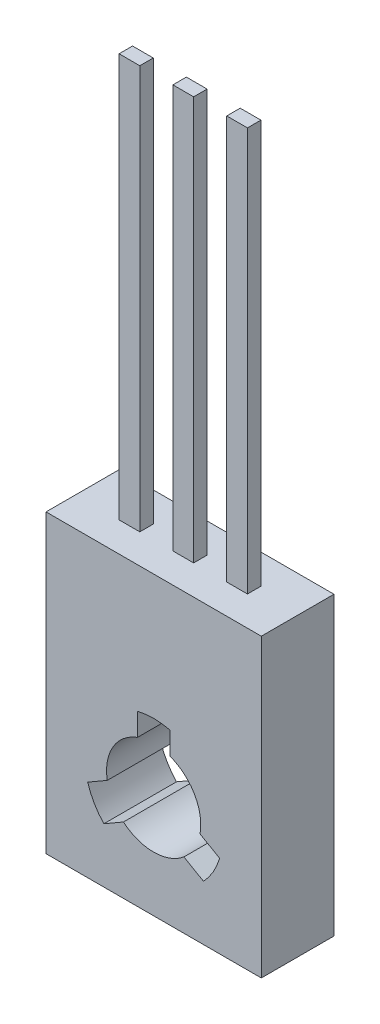
ISO-10303-21;
HEADER;
FILE_DESCRIPTION(('STEP AP214'),'2;1');
FILE_NAME('part.step','',(''),(''),'','','');
FILE_SCHEMA(('AUTOMOTIVE_DESIGN { 1 0 10303 214 1 1 1 1 }'));
ENDSEC;
DATA;
#1=APPLICATION_CONTEXT('core data for automotive mechanical design processes');
#2=APPLICATION_PROTOCOL_DEFINITION('international standard','automotive_design',2000,#1);
#3=PRODUCT_CONTEXT('',#1,'mechanical');
#4=PRODUCT('Part','Part','',(#3));
#5=PRODUCT_RELATED_PRODUCT_CATEGORY('part','',(#4));
#6=PRODUCT_DEFINITION_FORMATION('','',#4);
#7=PRODUCT_DEFINITION_CONTEXT('part definition',#1,'design');
#8=PRODUCT_DEFINITION('design','',#6,#7);
#9=PRODUCT_DEFINITION_SHAPE('','',#8);
#10=(LENGTH_UNIT() NAMED_UNIT(*) SI_UNIT(.MILLI.,.METRE.));
#11=(NAMED_UNIT(*) PLANE_ANGLE_UNIT() SI_UNIT($,.RADIAN.));
#12=(NAMED_UNIT(*) SI_UNIT($,.STERADIAN.) SOLID_ANGLE_UNIT());
#13=UNCERTAINTY_MEASURE_WITH_UNIT(LENGTH_MEASURE(1.E-05),#10,'distance_accuracy_value','');
#14=(GEOMETRIC_REPRESENTATION_CONTEXT(3) GLOBAL_UNCERTAINTY_ASSIGNED_CONTEXT((#13)) GLOBAL_UNIT_ASSIGNED_CONTEXT((#10,
#11,#12)) REPRESENTATION_CONTEXT('',''));
#15=CARTESIAN_POINT('',(0.,0.,0.));
#16=DIRECTION('',(0.,0.,1.));
#17=DIRECTION('',(1.,0.,0.));
#18=AXIS2_PLACEMENT_3D('',#15,#16,#17);
#19=CARTESIAN_POINT('',(0.,-1.7,1.35));
#20=DIRECTION('',(0.,0.,-1.));
#21=DIRECTION('',(-1.,0.,0.));
#22=AXIS2_PLACEMENT_3D('',#19,#20,#21);
#23=CYLINDRICAL_SURFACE('',#22,2.555);
#24=DIRECTION('',(0.,0.,-1.));
#25=VECTOR('',#24,1.);
#26=CARTESIAN_POINT('',(-1.85081815828303,-3.46139068493331,1.35));
#27=LINE('',#26,#25);
#28=CARTESIAN_POINT('',(-1.85081815828303,-3.46139068493331,-1.35));
#29=VERTEX_POINT('',#28);
#30=CARTESIAN_POINT('',(-1.85081815828303,-3.46139068493331,1.35));
#31=VERTEX_POINT('',#30);
#32=EDGE_CURVE('E264',#29,#31,#27,.F.);
#33=ORIENTED_EDGE('',*,*,#32,.F.);
#34=CARTESIAN_POINT('',(0.,-1.7,-1.35));
#35=DIRECTION('',(0.,0.,1.));
#36=DIRECTION('',(1.,0.,0.));
#37=AXIS2_PLACEMENT_3D('',#34,#35,#36);
#38=CIRCLE('',#37,2.555);
#39=CARTESIAN_POINT('',(-2.45081815828303,-2.42216020039198,-1.35));
#40=VERTEX_POINT('',#39);
#41=EDGE_CURVE('E461',#40,#29,#38,.T.);
#42=ORIENTED_EDGE('',*,*,#41,.F.);
#43=DIRECTION('',(0.,0.,-1.));
#44=VECTOR('',#43,1.);
#45=CARTESIAN_POINT('',(-2.45081815828303,-2.42216020039198,1.35));
#46=LINE('',#45,#44);
#47=CARTESIAN_POINT('',(-2.45081815828303,-2.42216020039198,1.35));
#48=VERTEX_POINT('',#47);
#49=EDGE_CURVE('E507',#48,#40,#46,.T.);
#50=ORIENTED_EDGE('',*,*,#49,.F.);
#51=CARTESIAN_POINT('',(0.,-1.7,1.35));
#52=DIRECTION('',(0.,0.,1.));
#53=DIRECTION('',(1.,0.,0.));
#54=AXIS2_PLACEMENT_3D('',#51,#52,#53);
#55=CIRCLE('',#54,2.555);
#56=EDGE_CURVE('E455',#48,#31,#55,.T.);
#57=ORIENTED_EDGE('',*,*,#56,.T.);
#58=EDGE_LOOP('',(#33,#42,#50,#57));
#59=FACE_BOUND('',#58,.T.);
#60=ADVANCED_FACE('F39',(#59),#23,.F.);
#61=DIRECTION('',(0.,0.,-1.));
#62=VECTOR('',#61,1.);
#63=CARTESIAN_POINT('',(1.85081815828303,-3.4613906849333,1.35));
#64=LINE('',#63,#62);
#65=CARTESIAN_POINT('',(1.85081815828303,-3.4613906849333,1.35));
#66=VERTEX_POINT('',#65);
#67=CARTESIAN_POINT('',(1.85081815828303,-3.4613906849333,-1.35));
#68=VERTEX_POINT('',#67);
#69=EDGE_CURVE('E260',#66,#68,#64,.T.);
#70=ORIENTED_EDGE('',*,*,#69,.F.);
#71=CARTESIAN_POINT('',(2.45081815828303,-2.42216020039198,1.35));
#72=VERTEX_POINT('',#71);
#73=EDGE_CURVE('E233',#66,#72,#55,.T.);
#74=ORIENTED_EDGE('',*,*,#73,.T.);
#75=DIRECTION('',(0.,0.,-1.));
#76=VECTOR('',#75,1.);
#77=CARTESIAN_POINT('',(2.45081815828303,-2.42216020039198,1.35));
#78=LINE('',#77,#76);
#79=CARTESIAN_POINT('',(2.45081815828303,-2.42216020039198,-1.35));
#80=VERTEX_POINT('',#79);
#81=EDGE_CURVE('E11',#80,#72,#78,.F.);
#82=ORIENTED_EDGE('',*,*,#81,.F.);
#83=EDGE_CURVE('E465',#68,#80,#38,.T.);
#84=ORIENTED_EDGE('',*,*,#83,.F.);
#85=EDGE_LOOP('',(#70,#74,#82,#84));
#86=FACE_BOUND('',#85,.T.);
#87=ADVANCED_FACE('F536',(#86),#23,.F.);
#88=CARTESIAN_POINT('',(-4.,5.5,1.35));
#89=DIRECTION('',(0.,-1.,0.));
#90=DIRECTION('',(0.,0.,-1.));
#91=AXIS2_PLACEMENT_3D('',#88,#89,#90);
#92=PLANE('',#91);
#93=DIRECTION('',(0.,0.,-1.));
#94=VECTOR('',#93,1.);
#95=CARTESIAN_POINT('',(-1.615,5.5,-0.25));
#96=LINE('',#95,#94);
#97=CARTESIAN_POINT('',(-1.615,5.5,0.25));
#98=VERTEX_POINT('',#97);
#99=CARTESIAN_POINT('',(-1.615,5.5,-0.25));
#100=VERTEX_POINT('',#99);
#101=EDGE_CURVE('E364',#98,#100,#96,.T.);
#102=ORIENTED_EDGE('',*,*,#101,.F.);
#103=DIRECTION('',(1.,0.,0.));
#104=VECTOR('',#103,1.);
#105=CARTESIAN_POINT('',(-2.385,5.5,0.25));
#106=LINE('',#105,#104);
#107=CARTESIAN_POINT('',(-2.385,5.5,0.25));
#108=VERTEX_POINT('',#107);
#109=EDGE_CURVE('E370',#108,#98,#106,.T.);
#110=ORIENTED_EDGE('',*,*,#109,.F.);
#111=DIRECTION('',(0.,0.,1.));
#112=VECTOR('',#111,1.);
#113=CARTESIAN_POINT('',(-2.385,5.5,-0.25));
#114=LINE('',#113,#112);
#115=CARTESIAN_POINT('',(-2.385,5.5,-0.25));
#116=VERTEX_POINT('',#115);
#117=EDGE_CURVE('E387',#116,#108,#114,.T.);
#118=ORIENTED_EDGE('',*,*,#117,.F.);
#119=DIRECTION('',(-1.,0.,0.));
#120=VECTOR('',#119,1.);
#121=CARTESIAN_POINT('',(-2.385,5.5,-0.25));
#122=LINE('',#121,#120);
#123=EDGE_CURVE('E383',#100,#116,#122,.T.);
#124=ORIENTED_EDGE('',*,*,#123,.F.);
#125=EDGE_LOOP('',(#102,#110,#118,#124));
#126=FACE_BOUND('',#125,.T.);
#127=DIRECTION('',(-1.,0.,0.));
#128=VECTOR('',#127,1.);
#129=CARTESIAN_POINT('',(-4.,5.5,-1.35));
#130=LINE('',#129,#128);
#131=CARTESIAN_POINT('',(4.,5.5,-1.35));
#132=VERTEX_POINT('',#131);
#133=CARTESIAN_POINT('',(-4.,5.5,-1.35));
#134=VERTEX_POINT('',#133);
#135=EDGE_CURVE('E484',#132,#134,#130,.T.);
#136=ORIENTED_EDGE('',*,*,#135,.T.);
#137=DIRECTION('',(0.,0.,-1.));
#138=VECTOR('',#137,1.);
#139=CARTESIAN_POINT('',(-4.,5.5,1.35));
#140=LINE('',#139,#138);
#141=CARTESIAN_POINT('',(-4.,5.5,1.35));
#142=VERTEX_POINT('',#141);
#143=EDGE_CURVE('E499',#142,#134,#140,.T.);
#144=ORIENTED_EDGE('',*,*,#143,.F.);
#145=DIRECTION('',(-1.,0.,0.));
#146=VECTOR('',#145,1.);
#147=CARTESIAN_POINT('',(-4.,5.5,1.35));
#148=LINE('',#147,#146);
#149=CARTESIAN_POINT('',(4.,5.5,1.35));
#150=VERTEX_POINT('',#149);
#151=EDGE_CURVE('E470',#150,#142,#148,.T.);
#152=ORIENTED_EDGE('',*,*,#151,.F.);
#153=DIRECTION('',(0.,0.,-1.));
#154=VECTOR('',#153,1.);
#155=CARTESIAN_POINT('',(4.,5.5,1.35));
#156=LINE('',#155,#154);
#157=EDGE_CURVE('E503',#150,#132,#156,.T.);
#158=ORIENTED_EDGE('',*,*,#157,.T.);
#159=EDGE_LOOP('',(#136,#144,#152,#158));
#160=FACE_BOUND('',#159,.T.);
#161=DIRECTION('',(0.,0.,-1.));
#162=VECTOR('',#161,1.);
#163=CARTESIAN_POINT('',(0.385,5.5,-0.25));
#164=LINE('',#163,#162);
#165=CARTESIAN_POINT('',(0.385,5.5,0.25));
#166=VERTEX_POINT('',#165);
#167=CARTESIAN_POINT('',(0.385000000000001,5.5,-0.25));
#168=VERTEX_POINT('',#167);
#169=EDGE_CURVE('E409',#166,#168,#164,.T.);
#170=ORIENTED_EDGE('',*,*,#169,.F.);
#171=DIRECTION('',(1.,0.,0.));
#172=VECTOR('',#171,1.);
#173=CARTESIAN_POINT('',(-0.385,5.5,0.25));
#174=LINE('',#173,#172);
#175=CARTESIAN_POINT('',(-0.385,5.5,0.25));
#176=VERTEX_POINT('',#175);
#177=EDGE_CURVE('E415',#176,#166,#174,.T.);
#178=ORIENTED_EDGE('',*,*,#177,.F.);
#179=DIRECTION('',(0.,0.,1.));
#180=VECTOR('',#179,1.);
#181=CARTESIAN_POINT('',(-0.385,5.5,-0.25));
#182=LINE('',#181,#180);
#183=CARTESIAN_POINT('',(-0.385,5.5,-0.25));
#184=VERTEX_POINT('',#183);
#185=EDGE_CURVE('E432',#184,#176,#182,.T.);
#186=ORIENTED_EDGE('',*,*,#185,.F.);
#187=DIRECTION('',(-1.,0.,0.));
#188=VECTOR('',#187,1.);
#189=CARTESIAN_POINT('',(-0.385,5.5,-0.25));
#190=LINE('',#189,#188);
#191=EDGE_CURVE('E428',#168,#184,#190,.T.);
#192=ORIENTED_EDGE('',*,*,#191,.F.);
#193=EDGE_LOOP('',(#170,#178,#186,#192));
#194=FACE_BOUND('',#193,.T.);
#195=DIRECTION('',(0.,0.,-1.));
#196=VECTOR('',#195,1.);
#197=CARTESIAN_POINT('',(2.385,5.5,-0.25));
#198=LINE('',#197,#196);
#199=CARTESIAN_POINT('',(2.385,5.5,0.25));
#200=VERTEX_POINT('',#199);
#201=CARTESIAN_POINT('',(2.385,5.5,-0.25));
#202=VERTEX_POINT('',#201);
#203=EDGE_CURVE('E319',#200,#202,#198,.T.);
#204=ORIENTED_EDGE('',*,*,#203,.F.);
#205=DIRECTION('',(1.,0.,0.));
#206=VECTOR('',#205,1.);
#207=CARTESIAN_POINT('',(2.385,5.5,0.25));
#208=LINE('',#207,#206);
#209=CARTESIAN_POINT('',(1.615,5.5,0.25));
#210=VERTEX_POINT('',#209);
#211=EDGE_CURVE('E325',#210,#200,#208,.T.);
#212=ORIENTED_EDGE('',*,*,#211,.F.);
#213=DIRECTION('',(0.,0.,1.));
#214=VECTOR('',#213,1.);
#215=CARTESIAN_POINT('',(1.615,5.5,-0.25));
#216=LINE('',#215,#214);
#217=CARTESIAN_POINT('',(1.615,5.5,-0.25));
#218=VERTEX_POINT('',#217);
#219=EDGE_CURVE('E342',#218,#210,#216,.T.);
#220=ORIENTED_EDGE('',*,*,#219,.F.);
#221=DIRECTION('',(-1.,0.,0.));
#222=VECTOR('',#221,1.);
#223=CARTESIAN_POINT('',(2.385,5.5,-0.25));
#224=LINE('',#223,#222);
#225=EDGE_CURVE('E338',#202,#218,#224,.T.);
#226=ORIENTED_EDGE('',*,*,#225,.F.);
#227=EDGE_LOOP('',(#204,#212,#220,#226));
#228=FACE_BOUND('',#227,.T.);
#229=ADVANCED_FACE('F575',(#126,#160,#194,#228),#92,.F.);
#230=CARTESIAN_POINT('',(0.,0.,1.35));
#231=DIRECTION('',(0.,0.,1.));
#232=DIRECTION('',(1.,0.,0.));
#233=AXIS2_PLACEMENT_3D('',#230,#231,#232);
#234=PLANE('',#233);
#235=ORIENTED_EDGE('',*,*,#73,.F.);
#236=DIRECTION('',(-0.866025403784439,0.5,0.));
#237=VECTOR('',#236,1.);
#238=CARTESIAN_POINT('',(1.88519222042062,-3.48123655896159,1.35));
#239=LINE('',#238,#237);
#240=CARTESIAN_POINT('',(1.12368360249039,-3.04157935340934,1.35));
#241=VERTEX_POINT('',#240);
#242=EDGE_CURVE('E224',#66,#241,#239,.T.);
#243=ORIENTED_EDGE('',*,*,#242,.T.);
#244=CARTESIAN_POINT('',(0.,-1.7,1.35));
#245=DIRECTION('',(0.,0.,-1.));
#246=DIRECTION('',(1.,0.,0.));
#247=AXIS2_PLACEMENT_3D('',#244,#245,#246);
#248=CIRCLE('',#247,1.75);
#249=CARTESIAN_POINT('',(-1.12368360249038,-3.04157935340934,1.35));
#250=VERTEX_POINT('',#249);
#251=EDGE_CURVE('E230',#241,#250,#248,.T.);
#252=ORIENTED_EDGE('',*,*,#251,.T.);
#253=DIRECTION('',(-0.866025403784438,-0.500000000000001,0.));
#254=VECTOR('',#253,1.);
#255=CARTESIAN_POINT('',(-1.88519222042062,-3.48123655896159,1.35));
#256=LINE('',#255,#254);
#257=EDGE_CURVE('E245',#250,#31,#256,.T.);
#258=ORIENTED_EDGE('',*,*,#257,.T.);
#259=ORIENTED_EDGE('',*,*,#56,.F.);
#260=DIRECTION('',(0.866025403784438,0.5,0.));
#261=VECTOR('',#260,1.);
#262=CARTESIAN_POINT('',(-2.48519222042062,-2.44200607442026,1.35));
#263=LINE('',#262,#261);
#264=CARTESIAN_POINT('',(-1.72368360249038,-2.00234886886802,1.35));
#265=VERTEX_POINT('',#264);
#266=EDGE_CURVE('E292',#48,#265,#263,.T.);
#267=ORIENTED_EDGE('',*,*,#266,.T.);
#268=CARTESIAN_POINT('',(0.,-1.7,1.35));
#269=DIRECTION('',(0.,0.,-1.));
#270=DIRECTION('',(1.,0.,0.));
#271=AXIS2_PLACEMENT_3D('',#268,#269,#270);
#272=CIRCLE('',#271,1.75);
#273=CARTESIAN_POINT('',(-0.6,-0.0560717777226403,1.35));
#274=VERTEX_POINT('',#273);
#275=EDGE_CURVE('E303',#265,#274,#272,.T.);
#276=ORIENTED_EDGE('',*,*,#275,.T.);
#277=DIRECTION('',(0.,1.,0.));
#278=VECTOR('',#277,1.);
#279=CARTESIAN_POINT('',(-0.6,0.823242633381846,1.35));
#280=LINE('',#279,#278);
#281=CARTESIAN_POINT('',(-0.6,0.783550885325284,1.35));
#282=VERTEX_POINT('',#281);
#283=EDGE_CURVE('E307',#274,#282,#280,.T.);
#284=ORIENTED_EDGE('',*,*,#283,.T.);
#285=CARTESIAN_POINT('',(0.6,0.783550885325284,1.35));
#286=VERTEX_POINT('',#285);
#287=EDGE_CURVE('E460',#286,#282,#55,.T.);
#288=ORIENTED_EDGE('',*,*,#287,.F.);
#289=DIRECTION('',(0.,-1.,0.));
#290=VECTOR('',#289,1.);
#291=CARTESIAN_POINT('',(0.6,0.823242633381846,1.35));
#292=LINE('',#291,#290);
#293=CARTESIAN_POINT('',(0.6,-0.0560717777226401,1.35));
#294=VERTEX_POINT('',#293);
#295=EDGE_CURVE('E267',#286,#294,#292,.T.);
#296=ORIENTED_EDGE('',*,*,#295,.T.);
#297=CARTESIAN_POINT('',(0.,-1.7,1.35));
#298=DIRECTION('',(0.,0.,-1.));
#299=DIRECTION('',(1.,0.,0.));
#300=AXIS2_PLACEMENT_3D('',#297,#298,#299);
#301=CIRCLE('',#300,1.75);
#302=CARTESIAN_POINT('',(1.72368360249038,-2.00234886886802,1.35));
#303=VERTEX_POINT('',#302);
#304=EDGE_CURVE('E277',#294,#303,#301,.T.);
#305=ORIENTED_EDGE('',*,*,#304,.T.);
#306=DIRECTION('',(0.866025403784439,-0.499999999999999,0.));
#307=VECTOR('',#306,1.);
#308=CARTESIAN_POINT('',(2.48519222042062,-2.44200607442026,1.35));
#309=LINE('',#308,#307);
#310=EDGE_CURVE('E281',#303,#72,#309,.T.);
#311=ORIENTED_EDGE('',*,*,#310,.T.);
#312=EDGE_LOOP('',(#235,#243,#252,#258,#259,#267,#276,#284,#288,#296,#305,#311));
#313=FACE_BOUND('',#312,.T.);
#314=DIRECTION('',(0.,1.,0.));
#315=VECTOR('',#314,1.);
#316=CARTESIAN_POINT('',(4.,5.5,1.35));
#317=LINE('',#316,#315);
#318=CARTESIAN_POINT('',(4.,-5.5,1.35));
#319=VERTEX_POINT('',#318);
#320=EDGE_CURVE('E466',#319,#150,#317,.T.);
#321=ORIENTED_EDGE('',*,*,#320,.T.);
#322=ORIENTED_EDGE('',*,*,#151,.T.);
#323=DIRECTION('',(0.,-1.,0.));
#324=VECTOR('',#323,1.);
#325=CARTESIAN_POINT('',(-4.,5.5,1.35));
#326=LINE('',#325,#324);
#327=CARTESIAN_POINT('',(-4.,-5.5,1.35));
#328=VERTEX_POINT('',#327);
#329=EDGE_CURVE('E474',#142,#328,#326,.T.);
#330=ORIENTED_EDGE('',*,*,#329,.T.);
#331=DIRECTION('',(1.,0.,0.));
#332=VECTOR('',#331,1.);
#333=CARTESIAN_POINT('',(-4.,-5.5,1.35));
#334=LINE('',#333,#332);
#335=EDGE_CURVE('E477',#328,#319,#334,.T.);
#336=ORIENTED_EDGE('',*,*,#335,.T.);
#337=EDGE_LOOP('',(#321,#322,#330,#336));
#338=FACE_BOUND('',#337,.T.);
#339=ADVANCED_FACE('F226',(#313,#338),#234,.T.);
#340=CARTESIAN_POINT('',(0.,0.,-1.35));
#341=DIRECTION('',(0.,0.,1.));
#342=DIRECTION('',(1.,0.,0.));
#343=AXIS2_PLACEMENT_3D('',#340,#341,#342);
#344=PLANE('',#343);
#345=DIRECTION('',(0.,1.,0.));
#346=VECTOR('',#345,1.);
#347=CARTESIAN_POINT('',(4.,5.5,-1.35));
#348=LINE('',#347,#346);
#349=CARTESIAN_POINT('',(4.,-5.5,-1.35));
#350=VERTEX_POINT('',#349);
#351=EDGE_CURVE('E459',#350,#132,#348,.T.);
#352=ORIENTED_EDGE('',*,*,#351,.F.);
#353=DIRECTION('',(1.,0.,0.));
#354=VECTOR('',#353,1.);
#355=CARTESIAN_POINT('',(-4.,-5.5,-1.35));
#356=LINE('',#355,#354);
#357=CARTESIAN_POINT('',(-4.,-5.5,-1.35));
#358=VERTEX_POINT('',#357);
#359=EDGE_CURVE('E471',#358,#350,#356,.T.);
#360=ORIENTED_EDGE('',*,*,#359,.F.);
#361=DIRECTION('',(0.,-1.,0.));
#362=VECTOR('',#361,1.);
#363=CARTESIAN_POINT('',(-4.,5.5,-1.35));
#364=LINE('',#363,#362);
#365=EDGE_CURVE('E487',#134,#358,#364,.T.);
#366=ORIENTED_EDGE('',*,*,#365,.F.);
#367=ORIENTED_EDGE('',*,*,#135,.F.);
#368=EDGE_LOOP('',(#352,#360,#366,#367));
#369=FACE_BOUND('',#368,.T.);
#370=ORIENTED_EDGE('',*,*,#41,.T.);
#371=DIRECTION('',(0.866025403784438,0.500000000000001,0.));
#372=VECTOR('',#371,1.);
#373=CARTESIAN_POINT('',(-1.88519222042062,-3.48123655896159,-1.35));
#374=LINE('',#373,#372);
#375=CARTESIAN_POINT('',(-1.12368360249038,-3.04157935340934,-1.35));
#376=VERTEX_POINT('',#375);
#377=EDGE_CURVE('E261',#29,#376,#374,.T.);
#378=ORIENTED_EDGE('',*,*,#377,.T.);
#379=CARTESIAN_POINT('',(0.,-1.7,-1.35));
#380=DIRECTION('',(0.,0.,1.));
#381=DIRECTION('',(1.,0.,0.));
#382=AXIS2_PLACEMENT_3D('',#379,#380,#381);
#383=CIRCLE('',#382,1.75);
#384=CARTESIAN_POINT('',(1.12368360249039,-3.04157935340934,-1.35));
#385=VERTEX_POINT('',#384);
#386=EDGE_CURVE('E256',#376,#385,#383,.T.);
#387=ORIENTED_EDGE('',*,*,#386,.T.);
#388=DIRECTION('',(0.866025403784439,-0.5,0.));
#389=VECTOR('',#388,1.);
#390=CARTESIAN_POINT('',(1.88519222042062,-3.48123655896159,-1.35));
#391=LINE('',#390,#389);
#392=EDGE_CURVE('E55',#385,#68,#391,.T.);
#393=ORIENTED_EDGE('',*,*,#392,.T.);
#394=ORIENTED_EDGE('',*,*,#83,.T.);
#395=DIRECTION('',(-0.866025403784439,0.499999999999999,0.));
#396=VECTOR('',#395,1.);
#397=CARTESIAN_POINT('',(2.48519222042062,-2.44200607442026,-1.35));
#398=LINE('',#397,#396);
#399=CARTESIAN_POINT('',(1.72368360249038,-2.00234886886802,-1.35));
#400=VERTEX_POINT('',#399);
#401=EDGE_CURVE('E271',#80,#400,#398,.T.);
#402=ORIENTED_EDGE('',*,*,#401,.T.);
#403=CARTESIAN_POINT('',(0.,-1.7,-1.35));
#404=DIRECTION('',(0.,0.,1.));
#405=DIRECTION('',(1.,0.,0.));
#406=AXIS2_PLACEMENT_3D('',#403,#404,#405);
#407=CIRCLE('',#406,1.75);
#408=CARTESIAN_POINT('',(0.6,-0.0560717777226401,-1.35));
#409=VERTEX_POINT('',#408);
#410=EDGE_CURVE('E268',#400,#409,#407,.T.);
#411=ORIENTED_EDGE('',*,*,#410,.T.);
#412=DIRECTION('',(0.,1.,0.));
#413=VECTOR('',#412,1.);
#414=CARTESIAN_POINT('',(0.6,0.823242633381846,-1.35));
#415=LINE('',#414,#413);
#416=CARTESIAN_POINT('',(0.6,0.783550885325284,-1.35));
#417=VERTEX_POINT('',#416);
#418=EDGE_CURVE('E62',#409,#417,#415,.T.);
#419=ORIENTED_EDGE('',*,*,#418,.T.);
#420=CARTESIAN_POINT('',(-0.6,0.783550885325284,-1.35));
#421=VERTEX_POINT('',#420);
#422=EDGE_CURVE('E454',#417,#421,#38,.T.);
#423=ORIENTED_EDGE('',*,*,#422,.T.);
#424=DIRECTION('',(0.,-1.,0.));
#425=VECTOR('',#424,1.);
#426=CARTESIAN_POINT('',(-0.6,0.823242633381846,-1.35));
#427=LINE('',#426,#425);
#428=CARTESIAN_POINT('',(-0.6,-0.0560717777226402,-1.35));
#429=VERTEX_POINT('',#428);
#430=EDGE_CURVE('E296',#421,#429,#427,.T.);
#431=ORIENTED_EDGE('',*,*,#430,.T.);
#432=CARTESIAN_POINT('',(0.,-1.7,-1.35));
#433=DIRECTION('',(0.,0.,1.));
#434=DIRECTION('',(1.,0.,0.));
#435=AXIS2_PLACEMENT_3D('',#432,#433,#434);
#436=CIRCLE('',#435,1.75);
#437=CARTESIAN_POINT('',(-1.72368360249038,-2.00234886886802,-1.35));
#438=VERTEX_POINT('',#437);
#439=EDGE_CURVE('E293',#429,#438,#436,.T.);
#440=ORIENTED_EDGE('',*,*,#439,.T.);
#441=DIRECTION('',(-0.866025403784438,-0.5,0.));
#442=VECTOR('',#441,1.);
#443=CARTESIAN_POINT('',(-2.48519222042062,-2.44200607442026,-1.35));
#444=LINE('',#443,#442);
#445=EDGE_CURVE('E300',#438,#40,#444,.T.);
#446=ORIENTED_EDGE('',*,*,#445,.T.);
#447=EDGE_LOOP('',(#370,#378,#387,#393,#394,#402,#411,#419,#423,#431,#440,#446));
#448=FACE_BOUND('',#447,.T.);
#449=ADVANCED_FACE('F528',(#369,#448),#344,.F.);
#450=CARTESIAN_POINT('',(4.,5.5,1.35));
#451=DIRECTION('',(-1.,0.,0.));
#452=DIRECTION('',(0.,-1.,0.));
#453=AXIS2_PLACEMENT_3D('',#450,#451,#452);
#454=PLANE('',#453);
#455=ORIENTED_EDGE('',*,*,#351,.T.);
#456=ORIENTED_EDGE('',*,*,#157,.F.);
#457=ORIENTED_EDGE('',*,*,#320,.F.);
#458=DIRECTION('',(0.,0.,-1.));
#459=VECTOR('',#458,1.);
#460=CARTESIAN_POINT('',(4.,-5.5,1.35));
#461=LINE('',#460,#459);
#462=EDGE_CURVE('E480',#319,#350,#461,.T.);
#463=ORIENTED_EDGE('',*,*,#462,.T.);
#464=EDGE_LOOP('',(#455,#456,#457,#463));
#465=FACE_BOUND('',#464,.T.);
#466=ADVANCED_FACE('F41',(#465),#454,.F.);
#467=CARTESIAN_POINT('',(-4.,5.5,1.35));
#468=DIRECTION('',(1.,0.,0.));
#469=DIRECTION('',(0.,1.,0.));
#470=AXIS2_PLACEMENT_3D('',#467,#468,#469);
#471=PLANE('',#470);
#472=ORIENTED_EDGE('',*,*,#365,.T.);
#473=DIRECTION('',(0.,0.,-1.));
#474=VECTOR('',#473,1.);
#475=CARTESIAN_POINT('',(-4.,-5.5,1.35));
#476=LINE('',#475,#474);
#477=EDGE_CURVE('E495',#328,#358,#476,.T.);
#478=ORIENTED_EDGE('',*,*,#477,.F.);
#479=ORIENTED_EDGE('',*,*,#329,.F.);
#480=ORIENTED_EDGE('',*,*,#143,.T.);
#481=EDGE_LOOP('',(#472,#478,#479,#480));
#482=FACE_BOUND('',#481,.T.);
#483=ADVANCED_FACE('F587',(#482),#471,.F.);
#484=CARTESIAN_POINT('',(-4.,-5.5,1.35));
#485=DIRECTION('',(0.,1.,0.));
#486=DIRECTION('',(0.,0.,1.));
#487=AXIS2_PLACEMENT_3D('',#484,#485,#486);
#488=PLANE('',#487);
#489=ORIENTED_EDGE('',*,*,#359,.T.);
#490=ORIENTED_EDGE('',*,*,#462,.F.);
#491=ORIENTED_EDGE('',*,*,#335,.F.);
#492=ORIENTED_EDGE('',*,*,#477,.T.);
#493=EDGE_LOOP('',(#489,#490,#491,#492));
#494=FACE_BOUND('',#493,.T.);
#495=ADVANCED_FACE('F580',(#494),#488,.F.);
#496=DIRECTION('',(0.,0.,-1.));
#497=VECTOR('',#496,1.);
#498=CARTESIAN_POINT('',(0.6,0.783550885325283,1.35));
#499=LINE('',#498,#497);
#500=EDGE_CURVE('E48',#286,#417,#499,.T.);
#501=ORIENTED_EDGE('',*,*,#500,.F.);
#502=ORIENTED_EDGE('',*,*,#287,.T.);
#503=DIRECTION('',(0.,0.,-1.));
#504=VECTOR('',#503,1.);
#505=CARTESIAN_POINT('',(-0.6,0.783550885325283,1.35));
#506=LINE('',#505,#504);
#507=EDGE_CURVE('E511',#421,#282,#506,.F.);
#508=ORIENTED_EDGE('',*,*,#507,.F.);
#509=ORIENTED_EDGE('',*,*,#422,.F.);
#510=EDGE_LOOP('',(#501,#502,#508,#509));
#511=FACE_BOUND('',#510,.T.);
#512=ADVANCED_FACE('F522',(#511),#23,.F.);
#513=CARTESIAN_POINT('',(0.385,20.5,-0.25));
#514=DIRECTION('',(-1.,0.,0.));
#515=DIRECTION('',(0.,0.,1.));
#516=AXIS2_PLACEMENT_3D('',#513,#514,#515);
#517=PLANE('',#516);
#518=ORIENTED_EDGE('',*,*,#169,.T.);
#519=DIRECTION('',(0.,-1.,0.));
#520=VECTOR('',#519,1.);
#521=CARTESIAN_POINT('',(0.385,20.5,-0.25));
#522=LINE('',#521,#520);
#523=CARTESIAN_POINT('',(0.385,20.5,-0.25));
#524=VERTEX_POINT('',#523);
#525=EDGE_CURVE('E450',#524,#168,#522,.T.);
#526=ORIENTED_EDGE('',*,*,#525,.F.);
#527=DIRECTION('',(0.,0.,-1.));
#528=VECTOR('',#527,1.);
#529=CARTESIAN_POINT('',(0.385,20.5,-0.25));
#530=LINE('',#529,#528);
#531=CARTESIAN_POINT('',(0.385,20.5,0.25));
#532=VERTEX_POINT('',#531);
#533=EDGE_CURVE('E410',#532,#524,#530,.T.);
#534=ORIENTED_EDGE('',*,*,#533,.F.);
#535=DIRECTION('',(0.,-1.,0.));
#536=VECTOR('',#535,1.);
#537=CARTESIAN_POINT('',(0.385,20.5,0.25));
#538=LINE('',#537,#536);
#539=EDGE_CURVE('E424',#532,#166,#538,.T.);
#540=ORIENTED_EDGE('',*,*,#539,.T.);
#541=EDGE_LOOP('',(#518,#526,#534,#540));
#542=FACE_BOUND('',#541,.T.);
#543=ADVANCED_FACE('F579',(#542),#517,.F.);
#544=CARTESIAN_POINT('',(-0.385,20.5,-0.25));
#545=DIRECTION('',(0.,0.,1.));
#546=DIRECTION('',(1.,0.,0.));
#547=AXIS2_PLACEMENT_3D('',#544,#545,#546);
#548=PLANE('',#547);
#549=ORIENTED_EDGE('',*,*,#191,.T.);
#550=DIRECTION('',(0.,-1.,0.));
#551=VECTOR('',#550,1.);
#552=CARTESIAN_POINT('',(-0.385,20.5,-0.25));
#553=LINE('',#552,#551);
#554=CARTESIAN_POINT('',(-0.385,20.5,-0.25));
#555=VERTEX_POINT('',#554);
#556=EDGE_CURVE('E446',#555,#184,#553,.T.);
#557=ORIENTED_EDGE('',*,*,#556,.F.);
#558=DIRECTION('',(-1.,0.,0.));
#559=VECTOR('',#558,1.);
#560=CARTESIAN_POINT('',(-0.385,20.5,-0.25));
#561=LINE('',#560,#559);
#562=EDGE_CURVE('E414',#524,#555,#561,.T.);
#563=ORIENTED_EDGE('',*,*,#562,.F.);
#564=ORIENTED_EDGE('',*,*,#525,.T.);
#565=EDGE_LOOP('',(#549,#557,#563,#564));
#566=FACE_BOUND('',#565,.T.);
#567=ADVANCED_FACE('F585',(#566),#548,.F.);
#568=CARTESIAN_POINT('',(-0.385,20.5,-0.25));
#569=DIRECTION('',(1.,0.,0.));
#570=DIRECTION('',(0.,0.,-1.));
#571=AXIS2_PLACEMENT_3D('',#568,#569,#570);
#572=PLANE('',#571);
#573=ORIENTED_EDGE('',*,*,#185,.T.);
#574=DIRECTION('',(0.,-1.,0.));
#575=VECTOR('',#574,1.);
#576=CARTESIAN_POINT('',(-0.385,20.5,0.25));
#577=LINE('',#576,#575);
#578=CARTESIAN_POINT('',(-0.385,20.5,0.25));
#579=VERTEX_POINT('',#578);
#580=EDGE_CURVE('E442',#579,#176,#577,.T.);
#581=ORIENTED_EDGE('',*,*,#580,.F.);
#582=DIRECTION('',(0.,0.,1.));
#583=VECTOR('',#582,1.);
#584=CARTESIAN_POINT('',(-0.385,20.5,-0.25));
#585=LINE('',#584,#583);
#586=EDGE_CURVE('E418',#555,#579,#585,.T.);
#587=ORIENTED_EDGE('',*,*,#586,.F.);
#588=ORIENTED_EDGE('',*,*,#556,.T.);
#589=EDGE_LOOP('',(#573,#581,#587,#588));
#590=FACE_BOUND('',#589,.T.);
#591=ADVANCED_FACE('F659',(#590),#572,.F.);
#592=CARTESIAN_POINT('',(-0.385,20.5,0.25));
#593=DIRECTION('',(0.,0.,-1.));
#594=DIRECTION('',(-1.,0.,0.));
#595=AXIS2_PLACEMENT_3D('',#592,#593,#594);
#596=PLANE('',#595);
#597=ORIENTED_EDGE('',*,*,#177,.T.);
#598=ORIENTED_EDGE('',*,*,#539,.F.);
#599=DIRECTION('',(1.,0.,0.));
#600=VECTOR('',#599,1.);
#601=CARTESIAN_POINT('',(-0.385,20.5,0.25));
#602=LINE('',#601,#600);
#603=EDGE_CURVE('E421',#579,#532,#602,.T.);
#604=ORIENTED_EDGE('',*,*,#603,.F.);
#605=ORIENTED_EDGE('',*,*,#580,.T.);
#606=EDGE_LOOP('',(#597,#598,#604,#605));
#607=FACE_BOUND('',#606,.T.);
#608=ADVANCED_FACE('F655',(#607),#596,.F.);
#609=CARTESIAN_POINT('',(0.,20.5,0.));
#610=DIRECTION('',(0.,1.,0.));
#611=DIRECTION('',(0.,0.,1.));
#612=AXIS2_PLACEMENT_3D('',#609,#610,#611);
#613=PLANE('',#612);
#614=ORIENTED_EDGE('',*,*,#533,.T.);
#615=ORIENTED_EDGE('',*,*,#562,.T.);
#616=ORIENTED_EDGE('',*,*,#586,.T.);
#617=ORIENTED_EDGE('',*,*,#603,.T.);
#618=EDGE_LOOP('',(#614,#615,#616,#617));
#619=FACE_BOUND('',#618,.T.);
#620=ADVANCED_FACE('F651',(#619),#613,.T.);
#621=CARTESIAN_POINT('',(-1.615,20.5,-0.25));
#622=DIRECTION('',(-1.,0.,0.));
#623=DIRECTION('',(0.,0.,1.));
#624=AXIS2_PLACEMENT_3D('',#621,#622,#623);
#625=PLANE('',#624);
#626=ORIENTED_EDGE('',*,*,#101,.T.);
#627=DIRECTION('',(0.,-1.,0.));
#628=VECTOR('',#627,1.);
#629=CARTESIAN_POINT('',(-1.615,20.5,-0.25));
#630=LINE('',#629,#628);
#631=CARTESIAN_POINT('',(-1.615,20.5,-0.25));
#632=VERTEX_POINT('',#631);
#633=EDGE_CURVE('E405',#632,#100,#630,.T.);
#634=ORIENTED_EDGE('',*,*,#633,.F.);
#635=DIRECTION('',(0.,0.,-1.));
#636=VECTOR('',#635,1.);
#637=CARTESIAN_POINT('',(-1.615,20.5,-0.25));
#638=LINE('',#637,#636);
#639=CARTESIAN_POINT('',(-1.615,20.5,0.25));
#640=VERTEX_POINT('',#639);
#641=EDGE_CURVE('E365',#640,#632,#638,.T.);
#642=ORIENTED_EDGE('',*,*,#641,.F.);
#643=DIRECTION('',(0.,-1.,0.));
#644=VECTOR('',#643,1.);
#645=CARTESIAN_POINT('',(-1.615,20.5,0.25));
#646=LINE('',#645,#644);
#647=EDGE_CURVE('E379',#640,#98,#646,.T.);
#648=ORIENTED_EDGE('',*,*,#647,.T.);
#649=EDGE_LOOP('',(#626,#634,#642,#648));
#650=FACE_BOUND('',#649,.T.);
#651=ADVANCED_FACE('F647',(#650),#625,.F.);
#652=CARTESIAN_POINT('',(-2.385,20.5,-0.25));
#653=DIRECTION('',(0.,0.,1.));
#654=DIRECTION('',(1.,0.,0.));
#655=AXIS2_PLACEMENT_3D('',#652,#653,#654);
#656=PLANE('',#655);
#657=ORIENTED_EDGE('',*,*,#123,.T.);
#658=DIRECTION('',(0.,-1.,0.));
#659=VECTOR('',#658,1.);
#660=CARTESIAN_POINT('',(-2.385,20.5,-0.25));
#661=LINE('',#660,#659);
#662=CARTESIAN_POINT('',(-2.385,20.5,-0.25));
#663=VERTEX_POINT('',#662);
#664=EDGE_CURVE('E401',#663,#116,#661,.T.);
#665=ORIENTED_EDGE('',*,*,#664,.F.);
#666=DIRECTION('',(-1.,0.,0.));
#667=VECTOR('',#666,1.);
#668=CARTESIAN_POINT('',(-2.385,20.5,-0.25));
#669=LINE('',#668,#667);
#670=EDGE_CURVE('E369',#632,#663,#669,.T.);
#671=ORIENTED_EDGE('',*,*,#670,.F.);
#672=ORIENTED_EDGE('',*,*,#633,.T.);
#673=EDGE_LOOP('',(#657,#665,#671,#672));
#674=FACE_BOUND('',#673,.T.);
#675=ADVANCED_FACE('F643',(#674),#656,.F.);
#676=CARTESIAN_POINT('',(-2.385,20.5,-0.25));
#677=DIRECTION('',(1.,0.,0.));
#678=DIRECTION('',(0.,0.,-1.));
#679=AXIS2_PLACEMENT_3D('',#676,#677,#678);
#680=PLANE('',#679);
#681=ORIENTED_EDGE('',*,*,#117,.T.);
#682=DIRECTION('',(0.,-1.,0.));
#683=VECTOR('',#682,1.);
#684=CARTESIAN_POINT('',(-2.385,20.5,0.25));
#685=LINE('',#684,#683);
#686=CARTESIAN_POINT('',(-2.385,20.5,0.25));
#687=VERTEX_POINT('',#686);
#688=EDGE_CURVE('E397',#687,#108,#685,.T.);
#689=ORIENTED_EDGE('',*,*,#688,.F.);
#690=DIRECTION('',(0.,0.,1.));
#691=VECTOR('',#690,1.);
#692=CARTESIAN_POINT('',(-2.385,20.5,-0.25));
#693=LINE('',#692,#691);
#694=EDGE_CURVE('E373',#663,#687,#693,.T.);
#695=ORIENTED_EDGE('',*,*,#694,.F.);
#696=ORIENTED_EDGE('',*,*,#664,.T.);
#697=EDGE_LOOP('',(#681,#689,#695,#696));
#698=FACE_BOUND('',#697,.T.);
#699=ADVANCED_FACE('F639',(#698),#680,.F.);
#700=CARTESIAN_POINT('',(-2.385,20.5,0.25));
#701=DIRECTION('',(0.,0.,-1.));
#702=DIRECTION('',(-1.,0.,0.));
#703=AXIS2_PLACEMENT_3D('',#700,#701,#702);
#704=PLANE('',#703);
#705=ORIENTED_EDGE('',*,*,#109,.T.);
#706=ORIENTED_EDGE('',*,*,#647,.F.);
#707=DIRECTION('',(1.,0.,0.));
#708=VECTOR('',#707,1.);
#709=CARTESIAN_POINT('',(-2.385,20.5,0.25));
#710=LINE('',#709,#708);
#711=EDGE_CURVE('E376',#687,#640,#710,.T.);
#712=ORIENTED_EDGE('',*,*,#711,.F.);
#713=ORIENTED_EDGE('',*,*,#688,.T.);
#714=EDGE_LOOP('',(#705,#706,#712,#713));
#715=FACE_BOUND('',#714,.T.);
#716=ADVANCED_FACE('F635',(#715),#704,.F.);
#717=CARTESIAN_POINT('',(0.,20.5,0.));
#718=DIRECTION('',(0.,1.,0.));
#719=DIRECTION('',(0.,0.,1.));
#720=AXIS2_PLACEMENT_3D('',#717,#718,#719);
#721=PLANE('',#720);
#722=ORIENTED_EDGE('',*,*,#641,.T.);
#723=ORIENTED_EDGE('',*,*,#670,.T.);
#724=ORIENTED_EDGE('',*,*,#694,.T.);
#725=ORIENTED_EDGE('',*,*,#711,.T.);
#726=EDGE_LOOP('',(#722,#723,#724,#725));
#727=FACE_BOUND('',#726,.T.);
#728=ADVANCED_FACE('F629',(#727),#721,.T.);
#729=CARTESIAN_POINT('',(2.385,20.5,-0.25));
#730=DIRECTION('',(-1.,0.,0.));
#731=DIRECTION('',(0.,0.,1.));
#732=AXIS2_PLACEMENT_3D('',#729,#730,#731);
#733=PLANE('',#732);
#734=ORIENTED_EDGE('',*,*,#203,.T.);
#735=DIRECTION('',(0.,-1.,0.));
#736=VECTOR('',#735,1.);
#737=CARTESIAN_POINT('',(2.385,20.5,-0.25));
#738=LINE('',#737,#736);
#739=CARTESIAN_POINT('',(2.385,20.5,-0.25));
#740=VERTEX_POINT('',#739);
#741=EDGE_CURVE('E360',#740,#202,#738,.T.);
#742=ORIENTED_EDGE('',*,*,#741,.F.);
#743=DIRECTION('',(0.,0.,-1.));
#744=VECTOR('',#743,1.);
#745=CARTESIAN_POINT('',(2.385,20.5,-0.25));
#746=LINE('',#745,#744);
#747=CARTESIAN_POINT('',(2.385,20.5,0.25));
#748=VERTEX_POINT('',#747);
#749=EDGE_CURVE('E320',#748,#740,#746,.T.);
#750=ORIENTED_EDGE('',*,*,#749,.F.);
#751=DIRECTION('',(0.,-1.,0.));
#752=VECTOR('',#751,1.);
#753=CARTESIAN_POINT('',(2.385,20.5,0.25));
#754=LINE('',#753,#752);
#755=EDGE_CURVE('E334',#748,#200,#754,.T.);
#756=ORIENTED_EDGE('',*,*,#755,.T.);
#757=EDGE_LOOP('',(#734,#742,#750,#756));
#758=FACE_BOUND('',#757,.T.);
#759=ADVANCED_FACE('F613',(#758),#733,.F.);
#760=CARTESIAN_POINT('',(2.385,20.5,-0.25));
#761=DIRECTION('',(0.,0.,1.));
#762=DIRECTION('',(1.,0.,0.));
#763=AXIS2_PLACEMENT_3D('',#760,#761,#762);
#764=PLANE('',#763);
#765=ORIENTED_EDGE('',*,*,#225,.T.);
#766=DIRECTION('',(0.,-1.,0.));
#767=VECTOR('',#766,1.);
#768=CARTESIAN_POINT('',(1.615,20.5,-0.25));
#769=LINE('',#768,#767);
#770=CARTESIAN_POINT('',(1.615,20.5,-0.25));
#771=VERTEX_POINT('',#770);
#772=EDGE_CURVE('E356',#771,#218,#769,.T.);
#773=ORIENTED_EDGE('',*,*,#772,.F.);
#774=DIRECTION('',(-1.,0.,0.));
#775=VECTOR('',#774,1.);
#776=CARTESIAN_POINT('',(2.385,20.5,-0.25));
#777=LINE('',#776,#775);
#778=EDGE_CURVE('E324',#740,#771,#777,.T.);
#779=ORIENTED_EDGE('',*,*,#778,.F.);
#780=ORIENTED_EDGE('',*,*,#741,.T.);
#781=EDGE_LOOP('',(#765,#773,#779,#780));
#782=FACE_BOUND('',#781,.T.);
#783=ADVANCED_FACE('F621',(#782),#764,.F.);
#784=CARTESIAN_POINT('',(1.615,20.5,-0.25));
#785=DIRECTION('',(1.,0.,0.));
#786=DIRECTION('',(0.,0.,-1.));
#787=AXIS2_PLACEMENT_3D('',#784,#785,#786);
#788=PLANE('',#787);
#789=ORIENTED_EDGE('',*,*,#219,.T.);
#790=DIRECTION('',(0.,-1.,0.));
#791=VECTOR('',#790,1.);
#792=CARTESIAN_POINT('',(1.615,20.5,0.25));
#793=LINE('',#792,#791);
#794=CARTESIAN_POINT('',(1.615,20.5,0.25));
#795=VERTEX_POINT('',#794);
#796=EDGE_CURVE('E352',#795,#210,#793,.T.);
#797=ORIENTED_EDGE('',*,*,#796,.F.);
#798=DIRECTION('',(0.,0.,1.));
#799=VECTOR('',#798,1.);
#800=CARTESIAN_POINT('',(1.615,20.5,-0.25));
#801=LINE('',#800,#799);
#802=EDGE_CURVE('E328',#771,#795,#801,.T.);
#803=ORIENTED_EDGE('',*,*,#802,.F.);
#804=ORIENTED_EDGE('',*,*,#772,.T.);
#805=EDGE_LOOP('',(#789,#797,#803,#804));
#806=FACE_BOUND('',#805,.T.);
#807=ADVANCED_FACE('F619',(#806),#788,.F.);
#808=CARTESIAN_POINT('',(2.385,20.5,0.25));
#809=DIRECTION('',(0.,0.,-1.));
#810=DIRECTION('',(-1.,0.,0.));
#811=AXIS2_PLACEMENT_3D('',#808,#809,#810);
#812=PLANE('',#811);
#813=ORIENTED_EDGE('',*,*,#211,.T.);
#814=ORIENTED_EDGE('',*,*,#755,.F.);
#815=DIRECTION('',(1.,0.,0.));
#816=VECTOR('',#815,1.);
#817=CARTESIAN_POINT('',(2.385,20.5,0.25));
#818=LINE('',#817,#816);
#819=EDGE_CURVE('E331',#795,#748,#818,.T.);
#820=ORIENTED_EDGE('',*,*,#819,.F.);
#821=ORIENTED_EDGE('',*,*,#796,.T.);
#822=EDGE_LOOP('',(#813,#814,#820,#821));
#823=FACE_BOUND('',#822,.T.);
#824=ADVANCED_FACE('F609',(#823),#812,.F.);
#825=CARTESIAN_POINT('',(0.,20.5,0.));
#826=DIRECTION('',(0.,-1.,0.));
#827=DIRECTION('',(0.,0.,-1.));
#828=AXIS2_PLACEMENT_3D('',#825,#826,#827);
#829=PLANE('',#828);
#830=ORIENTED_EDGE('',*,*,#749,.T.);
#831=ORIENTED_EDGE('',*,*,#778,.T.);
#832=ORIENTED_EDGE('',*,*,#802,.T.);
#833=ORIENTED_EDGE('',*,*,#819,.T.);
#834=EDGE_LOOP('',(#830,#831,#832,#833));
#835=FACE_BOUND('',#834,.T.);
#836=ADVANCED_FACE('F615',(#835),#829,.F.);
#837=CARTESIAN_POINT('',(-0.6,0.823242633381846,-5.3228265599492));
#838=DIRECTION('',(1.,0.,0.));
#839=DIRECTION('',(0.,1.,0.));
#840=AXIS2_PLACEMENT_3D('',#837,#838,#839);
#841=PLANE('',#840);
#842=ORIENTED_EDGE('',*,*,#430,.F.);
#843=ORIENTED_EDGE('',*,*,#507,.T.);
#844=ORIENTED_EDGE('',*,*,#283,.F.);
#845=DIRECTION('',(0.,0.,1.));
#846=VECTOR('',#845,1.);
#847=CARTESIAN_POINT('',(-0.6,-0.0560717777226403,-5.3228265599492));
#848=LINE('',#847,#846);
#849=EDGE_CURVE('E297',#429,#274,#848,.T.);
#850=ORIENTED_EDGE('',*,*,#849,.F.);
#851=EDGE_LOOP('',(#842,#843,#844,#850));
#852=FACE_BOUND('',#851,.T.);
#853=ADVANCED_FACE('F541',(#852),#841,.T.);
#854=CARTESIAN_POINT('',(0.,-1.7,-5.3228265599492));
#855=DIRECTION('',(0.,0.,1.));
#856=DIRECTION('',(1.,0.,0.));
#857=AXIS2_PLACEMENT_3D('',#854,#855,#856);
#858=CYLINDRICAL_SURFACE('',#857,1.75);
#859=ORIENTED_EDGE('',*,*,#439,.F.);
#860=ORIENTED_EDGE('',*,*,#849,.T.);
#861=ORIENTED_EDGE('',*,*,#275,.F.);
#862=DIRECTION('',(0.,0.,1.));
#863=VECTOR('',#862,1.);
#864=CARTESIAN_POINT('',(-1.72368360249038,-2.00234886886802,-5.3228265599492));
#865=LINE('',#864,#863);
#866=EDGE_CURVE('E311',#438,#265,#865,.T.);
#867=ORIENTED_EDGE('',*,*,#866,.F.);
#868=EDGE_LOOP('',(#859,#860,#861,#867));
#869=FACE_BOUND('',#868,.T.);
#870=ADVANCED_FACE('F548',(#869),#858,.F.);
#871=CARTESIAN_POINT('',(-2.48519222042062,-2.44200607442026,-5.3228265599492));
#872=DIRECTION('',(0.5,-0.866025403784438,0.));
#873=DIRECTION('',(0.866025403784438,0.5,0.));
#874=AXIS2_PLACEMENT_3D('',#871,#872,#873);
#875=PLANE('',#874);
#876=ORIENTED_EDGE('',*,*,#266,.F.);
#877=ORIENTED_EDGE('',*,*,#49,.T.);
#878=ORIENTED_EDGE('',*,*,#445,.F.);
#879=ORIENTED_EDGE('',*,*,#866,.T.);
#880=EDGE_LOOP('',(#876,#877,#878,#879));
#881=FACE_BOUND('',#880,.T.);
#882=ADVANCED_FACE('F553',(#881),#875,.T.);
#883=CARTESIAN_POINT('',(2.48519222042062,-2.44200607442026,-5.3228265599492));
#884=DIRECTION('',(-0.499999999999999,-0.866025403784439,0.));
#885=DIRECTION('',(0.866025403784439,-0.499999999999999,0.));
#886=AXIS2_PLACEMENT_3D('',#883,#884,#885);
#887=PLANE('',#886);
#888=ORIENTED_EDGE('',*,*,#401,.F.);
#889=ORIENTED_EDGE('',*,*,#81,.T.);
#890=ORIENTED_EDGE('',*,*,#310,.F.);
#891=DIRECTION('',(0.,0.,1.));
#892=VECTOR('',#891,1.);
#893=CARTESIAN_POINT('',(1.72368360249038,-2.00234886886802,-5.3228265599492));
#894=LINE('',#893,#892);
#895=EDGE_CURVE('E272',#400,#303,#894,.T.);
#896=ORIENTED_EDGE('',*,*,#895,.F.);
#897=EDGE_LOOP('',(#888,#889,#890,#896));
#898=FACE_BOUND('',#897,.T.);
#899=ADVANCED_FACE('F534',(#898),#887,.T.);
#900=CARTESIAN_POINT('',(0.,-1.7,-5.3228265599492));
#901=DIRECTION('',(0.,0.,1.));
#902=DIRECTION('',(1.,0.,0.));
#903=AXIS2_PLACEMENT_3D('',#900,#901,#902);
#904=CYLINDRICAL_SURFACE('',#903,1.75);
#905=ORIENTED_EDGE('',*,*,#410,.F.);
#906=ORIENTED_EDGE('',*,*,#895,.T.);
#907=ORIENTED_EDGE('',*,*,#304,.F.);
#908=DIRECTION('',(0.,0.,1.));
#909=VECTOR('',#908,1.);
#910=CARTESIAN_POINT('',(0.6,-0.0560717777226401,-5.3228265599492));
#911=LINE('',#910,#909);
#912=EDGE_CURVE('E284',#409,#294,#911,.T.);
#913=ORIENTED_EDGE('',*,*,#912,.F.);
#914=EDGE_LOOP('',(#905,#906,#907,#913));
#915=FACE_BOUND('',#914,.T.);
#916=ADVANCED_FACE('F568',(#915),#904,.F.);
#917=CARTESIAN_POINT('',(0.6,0.823242633381846,-5.3228265599492));
#918=DIRECTION('',(-1.,0.,0.));
#919=DIRECTION('',(0.,0.,1.));
#920=AXIS2_PLACEMENT_3D('',#917,#918,#919);
#921=PLANE('',#920);
#922=ORIENTED_EDGE('',*,*,#295,.F.);
#923=ORIENTED_EDGE('',*,*,#500,.T.);
#924=ORIENTED_EDGE('',*,*,#418,.F.);
#925=ORIENTED_EDGE('',*,*,#912,.T.);
#926=EDGE_LOOP('',(#922,#923,#924,#925));
#927=FACE_BOUND('',#926,.T.);
#928=ADVANCED_FACE('F518',(#927),#921,.T.);
#929=CARTESIAN_POINT('',(-1.88519222042062,-3.48123655896159,-5.3228265599492));
#930=DIRECTION('',(-0.500000000000001,0.866025403784438,0.));
#931=DIRECTION('',(-0.866025403784438,-0.500000000000001,0.));
#932=AXIS2_PLACEMENT_3D('',#929,#930,#931);
#933=PLANE('',#932);
#934=ORIENTED_EDGE('',*,*,#377,.F.);
#935=ORIENTED_EDGE('',*,*,#32,.T.);
#936=ORIENTED_EDGE('',*,*,#257,.F.);
#937=DIRECTION('',(0.,0.,1.));
#938=VECTOR('',#937,1.);
#939=CARTESIAN_POINT('',(-1.12368360249038,-3.04157935340934,-5.3228265599492));
#940=LINE('',#939,#938);
#941=EDGE_CURVE('E244',#376,#250,#940,.T.);
#942=ORIENTED_EDGE('',*,*,#941,.F.);
#943=EDGE_LOOP('',(#934,#935,#936,#942));
#944=FACE_BOUND('',#943,.T.);
#945=ADVANCED_FACE('F557',(#944),#933,.T.);
#946=CARTESIAN_POINT('',(0.,-1.7,-5.3228265599492));
#947=DIRECTION('',(0.,0.,1.));
#948=DIRECTION('',(1.,0.,0.));
#949=AXIS2_PLACEMENT_3D('',#946,#947,#948);
#950=CYLINDRICAL_SURFACE('',#949,1.75);
#951=ORIENTED_EDGE('',*,*,#386,.F.);
#952=ORIENTED_EDGE('',*,*,#941,.T.);
#953=ORIENTED_EDGE('',*,*,#251,.F.);
#954=DIRECTION('',(0.,0.,1.));
#955=VECTOR('',#954,1.);
#956=CARTESIAN_POINT('',(1.12368360249039,-3.04157935340934,-5.3228265599492));
#957=LINE('',#956,#955);
#958=EDGE_CURVE('E239',#385,#241,#957,.T.);
#959=ORIENTED_EDGE('',*,*,#958,.F.);
#960=EDGE_LOOP('',(#951,#952,#953,#959));
#961=FACE_BOUND('',#960,.T.);
#962=ADVANCED_FACE('F247',(#961),#950,.F.);
#963=CARTESIAN_POINT('',(1.88519222042062,-3.48123655896159,-5.3228265599492));
#964=DIRECTION('',(0.5,0.866025403784439,0.));
#965=DIRECTION('',(-0.866025403784439,0.5,0.));
#966=AXIS2_PLACEMENT_3D('',#963,#964,#965);
#967=PLANE('',#966);
#968=ORIENTED_EDGE('',*,*,#242,.F.);
#969=ORIENTED_EDGE('',*,*,#69,.T.);
#970=ORIENTED_EDGE('',*,*,#392,.F.);
#971=ORIENTED_EDGE('',*,*,#958,.T.);
#972=EDGE_LOOP('',(#968,#969,#970,#971));
#973=FACE_BOUND('',#972,.T.);
#974=ADVANCED_FACE('F240',(#973),#967,.T.);
#975=CLOSED_SHELL('',(#60,#87,#229,#339,#449,#466,#483,#495,#512,#543,#567,#591,#608,#620,#651,
#675,#699,#716,#728,#759,#783,#807,#824,#836,#853,#870,#882,#899,#916,#928,#945,#962,#974));
#976=MANIFOLD_SOLID_BREP('B2',#975);
#977=ADVANCED_BREP_SHAPE_REPRESENTATION('',(#18,#976),#14);
#978=SHAPE_DEFINITION_REPRESENTATION(#9,#977);
ENDSEC;
END-ISO-10303-21;
